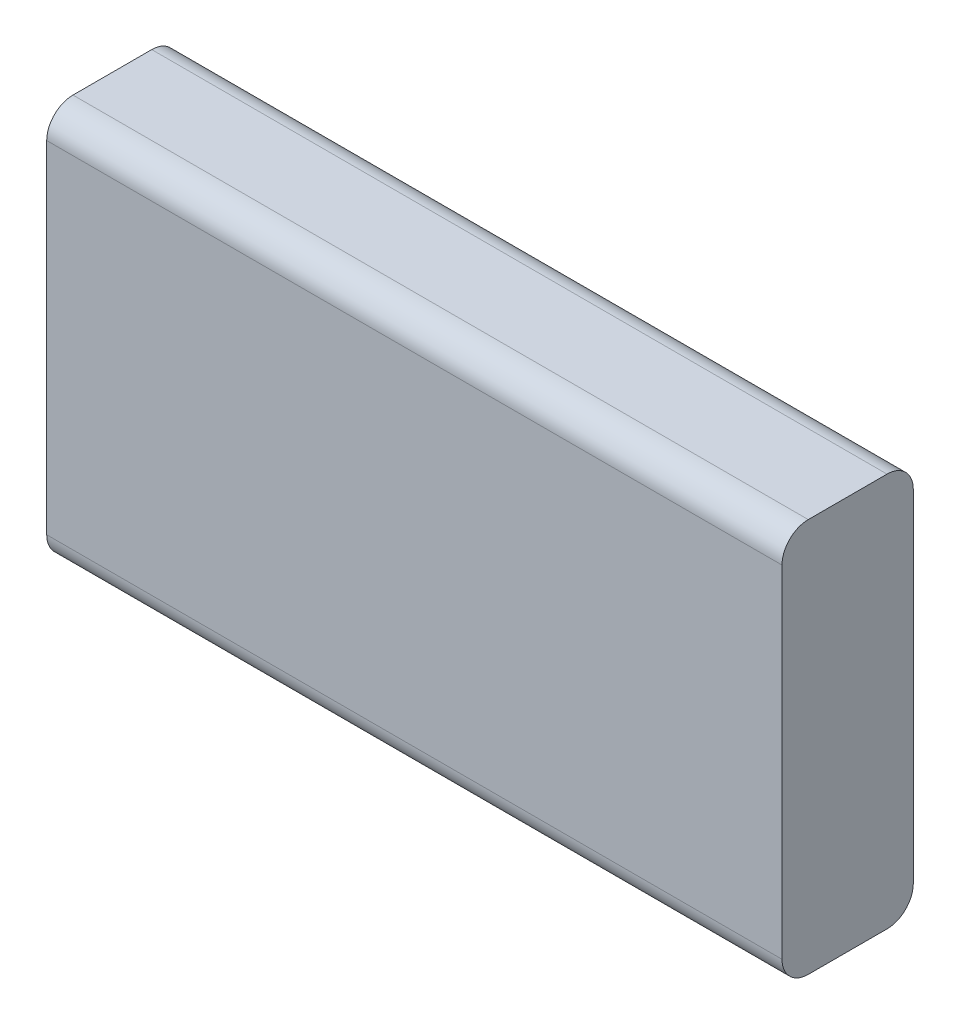
ISO-10303-21;
HEADER;
FILE_DESCRIPTION(('STEP AP214'),'2;1');
FILE_NAME('part.step','',(''),(''),'','','');
FILE_SCHEMA(('AUTOMOTIVE_DESIGN { 1 0 10303 214 1 1 1 1 }'));
ENDSEC;
DATA;
#1=APPLICATION_CONTEXT('core data for automotive mechanical design processes');
#2=APPLICATION_PROTOCOL_DEFINITION('international standard','automotive_design',2000,#1);
#3=PRODUCT_CONTEXT('',#1,'mechanical');
#4=PRODUCT('Part','Part','',(#3));
#5=PRODUCT_RELATED_PRODUCT_CATEGORY('part','',(#4));
#6=PRODUCT_DEFINITION_FORMATION('','',#4);
#7=PRODUCT_DEFINITION_CONTEXT('part definition',#1,'design');
#8=PRODUCT_DEFINITION('design','',#6,#7);
#9=PRODUCT_DEFINITION_SHAPE('','',#8);
#10=(LENGTH_UNIT() NAMED_UNIT(*) SI_UNIT(.MILLI.,.METRE.));
#11=(NAMED_UNIT(*) PLANE_ANGLE_UNIT() SI_UNIT($,.RADIAN.));
#12=(NAMED_UNIT(*) SI_UNIT($,.STERADIAN.) SOLID_ANGLE_UNIT());
#13=UNCERTAINTY_MEASURE_WITH_UNIT(LENGTH_MEASURE(1.E-05),#10,'distance_accuracy_value','');
#14=(GEOMETRIC_REPRESENTATION_CONTEXT(3) GLOBAL_UNCERTAINTY_ASSIGNED_CONTEXT((#13)) GLOBAL_UNIT_ASSIGNED_CONTEXT((#10,
#11,#12)) REPRESENTATION_CONTEXT('',''));
#15=CARTESIAN_POINT('',(0.,0.,0.));
#16=DIRECTION('',(0.,0.,1.));
#17=DIRECTION('',(1.,0.,0.));
#18=AXIS2_PLACEMENT_3D('',#15,#16,#17);
#19=CARTESIAN_POINT('',(0.,0.,10.));
#20=DIRECTION('',(1.,0.,0.));
#21=DIRECTION('',(0.,0.,-1.));
#22=AXIS2_PLACEMENT_3D('',#19,#20,#21);
#23=PLANE('',#22);
#24=DIRECTION('',(0.,0.,-1.));
#25=VECTOR('',#24,1.);
#26=CARTESIAN_POINT('',(0.,0.,10.));
#27=LINE('',#26,#25);
#28=CARTESIAN_POINT('',(0.,0.,8.));
#29=VERTEX_POINT('',#28);
#30=CARTESIAN_POINT('',(0.,0.,2.));
#31=VERTEX_POINT('',#30);
#32=EDGE_CURVE('E114',#29,#31,#27,.T.);
#33=ORIENTED_EDGE('',*,*,#32,.F.);
#34=CARTESIAN_POINT('',(0.,2.,8.));
#35=DIRECTION('',(1.,0.,0.));
#36=DIRECTION('',(0.,0.,-1.));
#37=AXIS2_PLACEMENT_3D('',#34,#35,#36);
#38=CIRCLE('',#37,2.);
#39=CARTESIAN_POINT('',(0.,2.,10.));
#40=VERTEX_POINT('',#39);
#41=EDGE_CURVE('E118',#29,#40,#38,.F.);
#42=ORIENTED_EDGE('',*,*,#41,.T.);
#43=DIRECTION('',(0.,-1.,0.));
#44=VECTOR('',#43,1.);
#45=CARTESIAN_POINT('',(0.,0.,10.));
#46=LINE('',#45,#44);
#47=CARTESIAN_POINT('',(0.,28.,10.));
#48=VERTEX_POINT('',#47);
#49=EDGE_CURVE('E109',#48,#40,#46,.T.);
#50=ORIENTED_EDGE('',*,*,#49,.F.);
#51=CARTESIAN_POINT('',(0.,28.,8.));
#52=DIRECTION('',(1.,0.,0.));
#53=DIRECTION('',(0.,0.,-1.));
#54=AXIS2_PLACEMENT_3D('',#51,#52,#53);
#55=CIRCLE('',#54,2.);
#56=CARTESIAN_POINT('',(0.,30.,8.));
#57=VERTEX_POINT('',#56);
#58=EDGE_CURVE('E55',#48,#57,#55,.F.);
#59=ORIENTED_EDGE('',*,*,#58,.T.);
#60=DIRECTION('',(0.,0.,-1.));
#61=VECTOR('',#60,1.);
#62=CARTESIAN_POINT('',(0.,30.,10.));
#63=LINE('',#62,#61);
#64=CARTESIAN_POINT('',(0.,30.,2.));
#65=VERTEX_POINT('',#64);
#66=EDGE_CURVE('E121',#57,#65,#63,.T.);
#67=ORIENTED_EDGE('',*,*,#66,.T.);
#68=CARTESIAN_POINT('',(0.,28.,2.));
#69=DIRECTION('',(1.,0.,0.));
#70=DIRECTION('',(0.,0.,-1.));
#71=AXIS2_PLACEMENT_3D('',#68,#69,#70);
#72=CIRCLE('',#71,2.);
#73=CARTESIAN_POINT('',(0.,28.,0.));
#74=VERTEX_POINT('',#73);
#75=EDGE_CURVE('E48',#65,#74,#72,.F.);
#76=ORIENTED_EDGE('',*,*,#75,.T.);
#77=DIRECTION('',(0.,-1.,0.));
#78=VECTOR('',#77,1.);
#79=CARTESIAN_POINT('',(0.,0.,0.));
#80=LINE('',#79,#78);
#81=CARTESIAN_POINT('',(0.,2.,0.));
#82=VERTEX_POINT('',#81);
#83=EDGE_CURVE('E124',#74,#82,#80,.T.);
#84=ORIENTED_EDGE('',*,*,#83,.T.);
#85=CARTESIAN_POINT('',(0.,2.,2.));
#86=DIRECTION('',(1.,0.,0.));
#87=DIRECTION('',(0.,0.,-1.));
#88=AXIS2_PLACEMENT_3D('',#85,#86,#87);
#89=CIRCLE('',#88,2.);
#90=EDGE_CURVE('E152',#82,#31,#89,.F.);
#91=ORIENTED_EDGE('',*,*,#90,.T.);
#92=EDGE_LOOP('',(#33,#42,#50,#59,#67,#76,#84,#91));
#93=FACE_BOUND('',#92,.T.);
#94=ADVANCED_FACE('F33',(#93),#23,.F.);
#95=CARTESIAN_POINT('',(0.,0.,10.));
#96=DIRECTION('',(0.,1.,0.));
#97=DIRECTION('',(0.,0.,1.));
#98=AXIS2_PLACEMENT_3D('',#95,#96,#97);
#99=PLANE('',#98);
#100=DIRECTION('',(0.,0.,-1.));
#101=VECTOR('',#100,1.);
#102=CARTESIAN_POINT('',(56.,0.,10.));
#103=LINE('',#102,#101);
#104=CARTESIAN_POINT('',(56.,0.,8.));
#105=VERTEX_POINT('',#104);
#106=CARTESIAN_POINT('',(56.,0.,2.));
#107=VERTEX_POINT('',#106);
#108=EDGE_CURVE('E133',#105,#107,#103,.T.);
#109=ORIENTED_EDGE('',*,*,#108,.F.);
#110=DIRECTION('',(1.,0.,0.));
#111=VECTOR('',#110,1.);
#112=CARTESIAN_POINT('',(0.,0.,8.));
#113=LINE('',#112,#111);
#114=EDGE_CURVE('E102',#105,#29,#113,.F.);
#115=ORIENTED_EDGE('',*,*,#114,.T.);
#116=ORIENTED_EDGE('',*,*,#32,.T.);
#117=DIRECTION('',(1.,0.,0.));
#118=VECTOR('',#117,1.);
#119=CARTESIAN_POINT('',(56.,0.,2.));
#120=LINE('',#119,#118);
#121=EDGE_CURVE('E147',#31,#107,#120,.T.);
#122=ORIENTED_EDGE('',*,*,#121,.T.);
#123=EDGE_LOOP('',(#109,#115,#116,#122));
#124=FACE_BOUND('',#123,.T.);
#125=ADVANCED_FACE('F176',(#124),#99,.F.);
#126=CARTESIAN_POINT('',(56.,0.,10.));
#127=DIRECTION('',(-1.,0.,0.));
#128=DIRECTION('',(0.,0.,1.));
#129=AXIS2_PLACEMENT_3D('',#126,#127,#128);
#130=PLANE('',#129);
#131=DIRECTION('',(0.,1.,0.));
#132=VECTOR('',#131,1.);
#133=CARTESIAN_POINT('',(56.,0.,10.));
#134=LINE('',#133,#132);
#135=CARTESIAN_POINT('',(56.,2.,10.));
#136=VERTEX_POINT('',#135);
#137=CARTESIAN_POINT('',(56.,28.,10.));
#138=VERTEX_POINT('',#137);
#139=EDGE_CURVE('E112',#136,#138,#134,.T.);
#140=ORIENTED_EDGE('',*,*,#139,.F.);
#141=CARTESIAN_POINT('',(56.,2.,8.));
#142=DIRECTION('',(-1.,0.,0.));
#143=DIRECTION('',(0.,0.,1.));
#144=AXIS2_PLACEMENT_3D('',#141,#142,#143);
#145=CIRCLE('',#144,2.);
#146=EDGE_CURVE('E145',#136,#105,#145,.F.);
#147=ORIENTED_EDGE('',*,*,#146,.T.);
#148=ORIENTED_EDGE('',*,*,#108,.T.);
#149=CARTESIAN_POINT('',(56.,2.,2.));
#150=DIRECTION('',(-1.,0.,0.));
#151=DIRECTION('',(0.,0.,1.));
#152=AXIS2_PLACEMENT_3D('',#149,#150,#151);
#153=CIRCLE('',#152,2.);
#154=CARTESIAN_POINT('',(56.,2.,0.));
#155=VERTEX_POINT('',#154);
#156=EDGE_CURVE('E143',#107,#155,#153,.F.);
#157=ORIENTED_EDGE('',*,*,#156,.T.);
#158=DIRECTION('',(0.,1.,0.));
#159=VECTOR('',#158,1.);
#160=CARTESIAN_POINT('',(56.,0.,0.));
#161=LINE('',#160,#159);
#162=CARTESIAN_POINT('',(56.,28.,0.));
#163=VERTEX_POINT('',#162);
#164=EDGE_CURVE('E119',#155,#163,#161,.T.);
#165=ORIENTED_EDGE('',*,*,#164,.T.);
#166=CARTESIAN_POINT('',(56.,28.,2.));
#167=DIRECTION('',(-1.,0.,0.));
#168=DIRECTION('',(0.,0.,1.));
#169=AXIS2_PLACEMENT_3D('',#166,#167,#168);
#170=CIRCLE('',#169,2.);
#171=CARTESIAN_POINT('',(56.,30.,2.));
#172=VERTEX_POINT('',#171);
#173=EDGE_CURVE('E141',#163,#172,#170,.F.);
#174=ORIENTED_EDGE('',*,*,#173,.T.);
#175=DIRECTION('',(0.,0.,-1.));
#176=VECTOR('',#175,1.);
#177=CARTESIAN_POINT('',(56.,30.,10.));
#178=LINE('',#177,#176);
#179=CARTESIAN_POINT('',(56.,30.,8.));
#180=VERTEX_POINT('',#179);
#181=EDGE_CURVE('E130',#180,#172,#178,.T.);
#182=ORIENTED_EDGE('',*,*,#181,.F.);
#183=CARTESIAN_POINT('',(56.,28.,8.));
#184=DIRECTION('',(-1.,0.,0.));
#185=DIRECTION('',(0.,0.,1.));
#186=AXIS2_PLACEMENT_3D('',#183,#184,#185);
#187=CIRCLE('',#186,2.);
#188=EDGE_CURVE('E139',#180,#138,#187,.F.);
#189=ORIENTED_EDGE('',*,*,#188,.T.);
#190=EDGE_LOOP('',(#140,#147,#148,#157,#165,#174,#182,#189));
#191=FACE_BOUND('',#190,.T.);
#192=ADVANCED_FACE('F162',(#191),#130,.F.);
#193=CARTESIAN_POINT('',(0.,30.,10.));
#194=DIRECTION('',(0.,-1.,0.));
#195=DIRECTION('',(0.,0.,-1.));
#196=AXIS2_PLACEMENT_3D('',#193,#194,#195);
#197=PLANE('',#196);
#198=ORIENTED_EDGE('',*,*,#181,.T.);
#199=DIRECTION('',(-1.,0.,0.));
#200=VECTOR('',#199,1.);
#201=CARTESIAN_POINT('',(0.,30.,2.));
#202=LINE('',#201,#200);
#203=EDGE_CURVE('E11',#172,#65,#202,.T.);
#204=ORIENTED_EDGE('',*,*,#203,.T.);
#205=ORIENTED_EDGE('',*,*,#66,.F.);
#206=DIRECTION('',(-1.,0.,0.));
#207=VECTOR('',#206,1.);
#208=CARTESIAN_POINT('',(0.,30.,8.));
#209=LINE('',#208,#207);
#210=EDGE_CURVE('E41',#57,#180,#209,.F.);
#211=ORIENTED_EDGE('',*,*,#210,.T.);
#212=EDGE_LOOP('',(#198,#204,#205,#211));
#213=FACE_BOUND('',#212,.T.);
#214=ADVANCED_FACE('F160',(#213),#197,.F.);
#215=CARTESIAN_POINT('',(0.,0.,10.));
#216=DIRECTION('',(0.,0.,-1.));
#217=DIRECTION('',(-1.,0.,0.));
#218=AXIS2_PLACEMENT_3D('',#215,#216,#217);
#219=PLANE('',#218);
#220=ORIENTED_EDGE('',*,*,#49,.T.);
#221=DIRECTION('',(1.,0.,0.));
#222=VECTOR('',#221,1.);
#223=CARTESIAN_POINT('',(0.,2.,10.));
#224=LINE('',#223,#222);
#225=EDGE_CURVE('E113',#40,#136,#224,.T.);
#226=ORIENTED_EDGE('',*,*,#225,.T.);
#227=ORIENTED_EDGE('',*,*,#139,.T.);
#228=DIRECTION('',(-1.,0.,0.));
#229=VECTOR('',#228,1.);
#230=CARTESIAN_POINT('',(0.,28.,10.));
#231=LINE('',#230,#229);
#232=EDGE_CURVE('E101',#138,#48,#231,.T.);
#233=ORIENTED_EDGE('',*,*,#232,.T.);
#234=EDGE_LOOP('',(#220,#226,#227,#233));
#235=FACE_BOUND('',#234,.T.);
#236=ADVANCED_FACE('F107',(#235),#219,.F.);
#237=CARTESIAN_POINT('',(0.,0.,0.));
#238=DIRECTION('',(0.,0.,-1.));
#239=DIRECTION('',(-1.,0.,0.));
#240=AXIS2_PLACEMENT_3D('',#237,#238,#239);
#241=PLANE('',#240);
#242=ORIENTED_EDGE('',*,*,#164,.F.);
#243=DIRECTION('',(1.,0.,0.));
#244=VECTOR('',#243,1.);
#245=CARTESIAN_POINT('',(0.,2.,0.));
#246=LINE('',#245,#244);
#247=EDGE_CURVE('E157',#155,#82,#246,.F.);
#248=ORIENTED_EDGE('',*,*,#247,.T.);
#249=ORIENTED_EDGE('',*,*,#83,.F.);
#250=DIRECTION('',(-1.,0.,0.));
#251=VECTOR('',#250,1.);
#252=CARTESIAN_POINT('',(56.,28.,0.));
#253=LINE('',#252,#251);
#254=EDGE_CURVE('E155',#74,#163,#253,.F.);
#255=ORIENTED_EDGE('',*,*,#254,.T.);
#256=EDGE_LOOP('',(#242,#248,#249,#255));
#257=FACE_BOUND('',#256,.T.);
#258=ADVANCED_FACE('F169',(#257),#241,.T.);
#259=CARTESIAN_POINT('',(0.,2.,8.));
#260=DIRECTION('',(1.,0.,0.));
#261=DIRECTION('',(0.,0.,-1.));
#262=AXIS2_PLACEMENT_3D('',#259,#260,#261);
#263=CYLINDRICAL_SURFACE('',#262,2.);
#264=ORIENTED_EDGE('',*,*,#41,.F.);
#265=ORIENTED_EDGE('',*,*,#114,.F.);
#266=ORIENTED_EDGE('',*,*,#146,.F.);
#267=ORIENTED_EDGE('',*,*,#225,.F.);
#268=EDGE_LOOP('',(#264,#265,#266,#267));
#269=FACE_BOUND('',#268,.T.);
#270=ADVANCED_FACE('F179',(#269),#263,.T.);
#271=CARTESIAN_POINT('',(0.,2.,2.));
#272=DIRECTION('',(-1.,0.,0.));
#273=DIRECTION('',(0.,0.,1.));
#274=AXIS2_PLACEMENT_3D('',#271,#272,#273);
#275=CYLINDRICAL_SURFACE('',#274,2.);
#276=ORIENTED_EDGE('',*,*,#90,.F.);
#277=ORIENTED_EDGE('',*,*,#247,.F.);
#278=ORIENTED_EDGE('',*,*,#156,.F.);
#279=ORIENTED_EDGE('',*,*,#121,.F.);
#280=EDGE_LOOP('',(#276,#277,#278,#279));
#281=FACE_BOUND('',#280,.T.);
#282=ADVANCED_FACE('F172',(#281),#275,.T.);
#283=CARTESIAN_POINT('',(0.,28.,2.));
#284=DIRECTION('',(1.,0.,0.));
#285=DIRECTION('',(0.,0.,-1.));
#286=AXIS2_PLACEMENT_3D('',#283,#284,#285);
#287=CYLINDRICAL_SURFACE('',#286,2.);
#288=ORIENTED_EDGE('',*,*,#173,.F.);
#289=ORIENTED_EDGE('',*,*,#254,.F.);
#290=ORIENTED_EDGE('',*,*,#75,.F.);
#291=ORIENTED_EDGE('',*,*,#203,.F.);
#292=EDGE_LOOP('',(#288,#289,#290,#291));
#293=FACE_BOUND('',#292,.T.);
#294=ADVANCED_FACE('F165',(#293),#287,.T.);
#295=CARTESIAN_POINT('',(0.,28.,8.));
#296=DIRECTION('',(-1.,0.,0.));
#297=DIRECTION('',(0.,0.,1.));
#298=AXIS2_PLACEMENT_3D('',#295,#296,#297);
#299=CYLINDRICAL_SURFACE('',#298,2.);
#300=ORIENTED_EDGE('',*,*,#188,.F.);
#301=ORIENTED_EDGE('',*,*,#210,.F.);
#302=ORIENTED_EDGE('',*,*,#58,.F.);
#303=ORIENTED_EDGE('',*,*,#232,.F.);
#304=EDGE_LOOP('',(#300,#301,#302,#303));
#305=FACE_BOUND('',#304,.T.);
#306=ADVANCED_FACE('F35',(#305),#299,.T.);
#307=CLOSED_SHELL('',(#94,#125,#192,#214,#236,#258,#270,#282,#294,#306));
#308=MANIFOLD_SOLID_BREP('B2',#307);
#309=ADVANCED_BREP_SHAPE_REPRESENTATION('',(#18,#308),#14);
#310=SHAPE_DEFINITION_REPRESENTATION(#9,#309);
ENDSEC;
END-ISO-10303-21;
